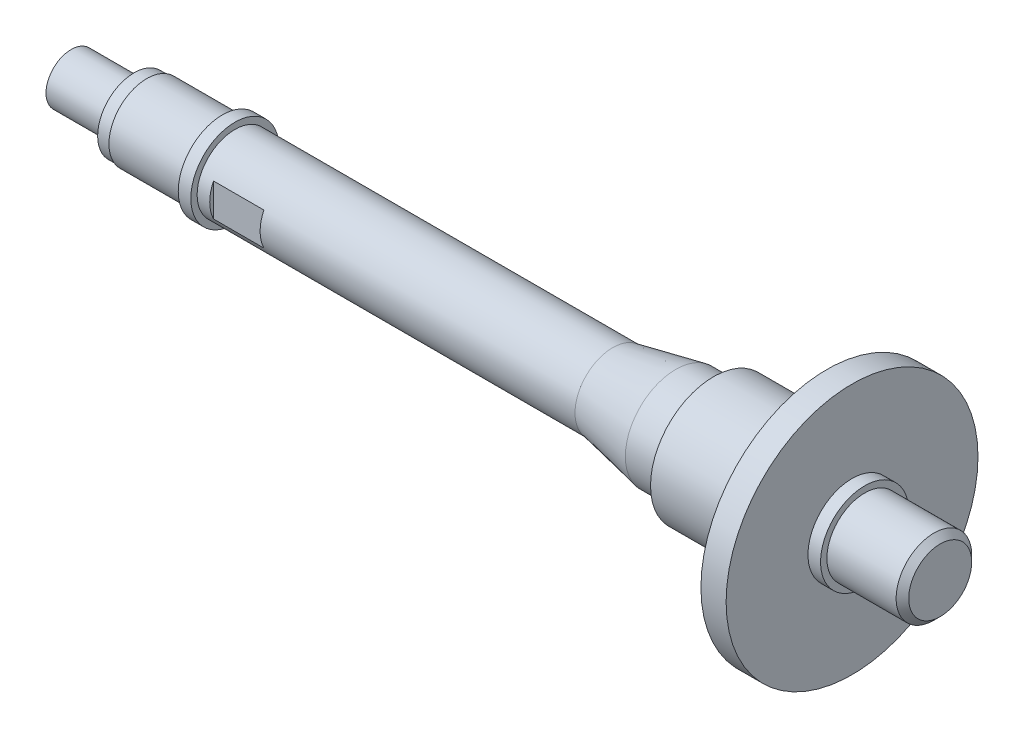
ISO-10303-21;
HEADER;
FILE_DESCRIPTION(('STEP AP214'),'2;1');
FILE_NAME('part.step','',(''),(''),'','','');
FILE_SCHEMA(('AUTOMOTIVE_DESIGN { 1 0 10303 214 1 1 1 1 }'));
ENDSEC;
DATA;
#1=APPLICATION_CONTEXT('core data for automotive mechanical design processes');
#2=APPLICATION_PROTOCOL_DEFINITION('international standard','automotive_design',2000,#1);
#3=PRODUCT_CONTEXT('',#1,'mechanical');
#4=PRODUCT('Part','Part','',(#3));
#5=PRODUCT_RELATED_PRODUCT_CATEGORY('part','',(#4));
#6=PRODUCT_DEFINITION_FORMATION('','',#4);
#7=PRODUCT_DEFINITION_CONTEXT('part definition',#1,'design');
#8=PRODUCT_DEFINITION('design','',#6,#7);
#9=PRODUCT_DEFINITION_SHAPE('','',#8);
#10=(LENGTH_UNIT() NAMED_UNIT(*) SI_UNIT(.MILLI.,.METRE.));
#11=(NAMED_UNIT(*) PLANE_ANGLE_UNIT() SI_UNIT($,.RADIAN.));
#12=(NAMED_UNIT(*) SI_UNIT($,.STERADIAN.) SOLID_ANGLE_UNIT());
#13=UNCERTAINTY_MEASURE_WITH_UNIT(LENGTH_MEASURE(1.E-05),#10,'distance_accuracy_value','');
#14=(GEOMETRIC_REPRESENTATION_CONTEXT(3) GLOBAL_UNCERTAINTY_ASSIGNED_CONTEXT((#13)) GLOBAL_UNIT_ASSIGNED_CONTEXT((#10,
#11,#12)) REPRESENTATION_CONTEXT('',''));
#15=CARTESIAN_POINT('',(0.,0.,0.));
#16=DIRECTION('',(0.,0.,1.));
#17=DIRECTION('',(1.,0.,0.));
#18=AXIS2_PLACEMENT_3D('',#15,#16,#17);
#19=CARTESIAN_POINT('',(-54.,0.,0.));
#20=DIRECTION('',(-1.,0.,0.));
#21=DIRECTION('',(0.,0.,1.));
#22=AXIS2_PLACEMENT_3D('',#19,#20,#21);
#23=CYLINDRICAL_SURFACE('',#22,2.9);
#24=CARTESIAN_POINT('',(-54.,0.,0.));
#25=DIRECTION('',(-1.,0.,0.));
#26=DIRECTION('',(0.,0.,1.));
#27=AXIS2_PLACEMENT_3D('',#24,#25,#26);
#28=CIRCLE('',#27,2.9);
#29=CARTESIAN_POINT('',(-54.,0.,2.9));
#30=VERTEX_POINT('',#29);
#31=EDGE_CURVE('E181',#30,#30,#28,.T.);
#32=ORIENTED_EDGE('',*,*,#31,.T.);
#33=EDGE_LOOP('',(#32));
#34=FACE_BOUND('',#33,.T.);
#35=CARTESIAN_POINT('',(-55.,0.,0.));
#36=DIRECTION('',(-1.,0.,0.));
#37=DIRECTION('',(0.,0.,1.));
#38=AXIS2_PLACEMENT_3D('',#35,#36,#37);
#39=CIRCLE('',#38,2.9);
#40=CARTESIAN_POINT('',(-55.,0.,2.9));
#41=VERTEX_POINT('',#40);
#42=EDGE_CURVE('E184',#41,#41,#39,.T.);
#43=ORIENTED_EDGE('',*,*,#42,.F.);
#44=EDGE_LOOP('',(#43));
#45=FACE_BOUND('',#44,.T.);
#46=ADVANCED_FACE('F42',(#34,#45),#23,.T.);
#47=CARTESIAN_POINT('',(-57.,0.,0.));
#48=DIRECTION('',(1.,0.,0.));
#49=DIRECTION('',(0.,0.,-1.));
#50=AXIS2_PLACEMENT_3D('',#47,#48,#49);
#51=CYLINDRICAL_SURFACE('',#50,3.);
#52=CARTESIAN_POINT('',(-48.,0.,0.));
#53=DIRECTION('',(-1.,0.,0.));
#54=DIRECTION('',(0.,0.,1.));
#55=AXIS2_PLACEMENT_3D('',#52,#53,#54);
#56=CIRCLE('',#55,3.);
#57=CARTESIAN_POINT('',(-48.,0.,3.));
#58=VERTEX_POINT('',#57);
#59=EDGE_CURVE('E147',#58,#58,#56,.T.);
#60=ORIENTED_EDGE('',*,*,#59,.T.);
#61=EDGE_LOOP('',(#60));
#62=FACE_BOUND('',#61,.T.);
#63=CARTESIAN_POINT('',(-54.,0.,0.));
#64=DIRECTION('',(-1.,0.,0.));
#65=DIRECTION('',(0.,0.,1.));
#66=AXIS2_PLACEMENT_3D('',#63,#64,#65);
#67=CIRCLE('',#66,3.);
#68=CARTESIAN_POINT('',(-54.,0.,3.));
#69=VERTEX_POINT('',#68);
#70=EDGE_CURVE('E178',#69,#69,#67,.T.);
#71=ORIENTED_EDGE('',*,*,#70,.F.);
#72=EDGE_LOOP('',(#71));
#73=FACE_BOUND('',#72,.T.);
#74=ADVANCED_FACE('F202',(#62,#73),#51,.T.);
#75=CARTESIAN_POINT('',(-3.,0.,0.));
#76=DIRECTION('',(-1.,0.,0.));
#77=DIRECTION('',(0.,0.,1.));
#78=AXIS2_PLACEMENT_3D('',#75,#76,#77);
#79=PLANE('',#78);
#80=CARTESIAN_POINT('',(-3.,0.,0.));
#81=DIRECTION('',(-1.,0.,0.));
#82=DIRECTION('',(0.,0.,1.));
#83=AXIS2_PLACEMENT_3D('',#80,#81,#82);
#84=CIRCLE('',#83,4.5);
#85=CARTESIAN_POINT('',(-3.,0.,4.5));
#86=VERTEX_POINT('',#85);
#87=EDGE_CURVE('E163',#86,#86,#84,.T.);
#88=ORIENTED_EDGE('',*,*,#87,.T.);
#89=EDGE_LOOP('',(#88));
#90=FACE_BOUND('',#89,.T.);
#91=CARTESIAN_POINT('',(-3.,0.,0.));
#92=DIRECTION('',(-1.,0.,0.));
#93=DIRECTION('',(0.,0.,1.));
#94=AXIS2_PLACEMENT_3D('',#91,#92,#93);
#95=CIRCLE('',#94,5.);
#96=CARTESIAN_POINT('',(-3.,0.,5.));
#97=VERTEX_POINT('',#96);
#98=EDGE_CURVE('E167',#97,#97,#95,.T.);
#99=ORIENTED_EDGE('',*,*,#98,.F.);
#100=EDGE_LOOP('',(#99));
#101=FACE_BOUND('',#100,.T.);
#102=ADVANCED_FACE('F208',(#90,#101),#79,.F.);
#103=CARTESIAN_POINT('',(-2.,0.,0.));
#104=DIRECTION('',(-1.,0.,0.));
#105=DIRECTION('',(0.,0.,1.));
#106=AXIS2_PLACEMENT_3D('',#103,#104,#105);
#107=PLANE('',#106);
#108=CARTESIAN_POINT('',(-2.,0.,0.));
#109=DIRECTION('',(-1.,0.,0.));
#110=DIRECTION('',(0.,0.,1.));
#111=AXIS2_PLACEMENT_3D('',#108,#109,#110);
#112=CIRCLE('',#111,6.);
#113=CARTESIAN_POINT('',(-2.,0.,6.));
#114=VERTEX_POINT('',#113);
#115=EDGE_CURVE('E95',#114,#114,#112,.T.);
#116=ORIENTED_EDGE('',*,*,#115,.T.);
#117=EDGE_LOOP('',(#116));
#118=FACE_BOUND('',#117,.T.);
#119=CARTESIAN_POINT('',(-2.,0.,0.));
#120=DIRECTION('',(-1.,0.,0.));
#121=DIRECTION('',(0.,0.,1.));
#122=AXIS2_PLACEMENT_3D('',#119,#120,#121);
#123=CIRCLE('',#122,4.5);
#124=CARTESIAN_POINT('',(-2.,0.,4.5));
#125=VERTEX_POINT('',#124);
#126=EDGE_CURVE('E164',#125,#125,#123,.T.);
#127=ORIENTED_EDGE('',*,*,#126,.F.);
#128=EDGE_LOOP('',(#127));
#129=FACE_BOUND('',#128,.T.);
#130=ADVANCED_FACE('F231',(#118,#129),#107,.T.);
#131=CARTESIAN_POINT('',(-3.,0.,0.));
#132=DIRECTION('',(1.,0.,0.));
#133=DIRECTION('',(0.,0.,-1.));
#134=AXIS2_PLACEMENT_3D('',#131,#132,#133);
#135=CYLINDRICAL_SURFACE('',#134,4.5);
#136=ORIENTED_EDGE('',*,*,#87,.F.);
#137=EDGE_LOOP('',(#136));
#138=FACE_BOUND('',#137,.T.);
#139=ORIENTED_EDGE('',*,*,#126,.T.);
#140=EDGE_LOOP('',(#139));
#141=FACE_BOUND('',#140,.T.);
#142=ADVANCED_FACE('F227',(#138,#141),#135,.T.);
#143=CARTESIAN_POINT('',(9.,0.,0.));
#144=DIRECTION('',(1.,0.,0.));
#145=DIRECTION('',(0.,0.,-1.));
#146=AXIS2_PLACEMENT_3D('',#143,#144,#145);
#147=PLANE('',#146);
#148=CARTESIAN_POINT('',(9.,0.,0.));
#149=DIRECTION('',(1.,0.,0.));
#150=DIRECTION('',(0.,0.,-1.));
#151=AXIS2_PLACEMENT_3D('',#148,#149,#150);
#152=CIRCLE('',#151,2.5);
#153=CARTESIAN_POINT('',(9.,0.,-2.5));
#154=VERTEX_POINT('',#153);
#155=EDGE_CURVE('E113',#154,#154,#152,.T.);
#156=ORIENTED_EDGE('',*,*,#155,.T.);
#157=EDGE_LOOP('',(#156));
#158=FACE_BOUND('',#157,.T.);
#159=ADVANCED_FACE('F230',(#158),#147,.T.);
#160=CARTESIAN_POINT('',(9.,0.,0.));
#161=DIRECTION('',(-1.,0.,0.));
#162=DIRECTION('',(0.,0.,1.));
#163=AXIS2_PLACEMENT_3D('',#160,#161,#162);
#164=CONICAL_SURFACE('',#163,2.5,0.785398163397451);
#165=CARTESIAN_POINT('',(8.50000000000001,0.,0.));
#166=DIRECTION('',(1.,0.,0.));
#167=DIRECTION('',(0.,0.,-1.));
#168=AXIS2_PLACEMENT_3D('',#165,#166,#167);
#169=CIRCLE('',#168,3.);
#170=CARTESIAN_POINT('',(8.50000000000001,0.,-3.));
#171=VERTEX_POINT('',#170);
#172=EDGE_CURVE('E110',#171,#171,#169,.F.);
#173=ORIENTED_EDGE('',*,*,#172,.F.);
#174=EDGE_LOOP('',(#173));
#175=FACE_BOUND('',#174,.T.);
#176=ORIENTED_EDGE('',*,*,#155,.F.);
#177=EDGE_LOOP('',(#176));
#178=FACE_BOUND('',#177,.T.);
#179=ADVANCED_FACE('F44',(#175,#178),#164,.T.);
#180=CARTESIAN_POINT('',(9.,0.,0.));
#181=DIRECTION('',(-1.,0.,0.));
#182=DIRECTION('',(0.,0.,1.));
#183=AXIS2_PLACEMENT_3D('',#180,#181,#182);
#184=CYLINDRICAL_SURFACE('',#183,3.);
#185=ORIENTED_EDGE('',*,*,#172,.T.);
#186=EDGE_LOOP('',(#185));
#187=FACE_BOUND('',#186,.T.);
#188=CARTESIAN_POINT('',(3.,0.,0.));
#189=DIRECTION('',(1.,0.,0.));
#190=DIRECTION('',(0.,0.,-1.));
#191=AXIS2_PLACEMENT_3D('',#188,#189,#190);
#192=CIRCLE('',#191,3.);
#193=CARTESIAN_POINT('',(3.,0.,-3.));
#194=VERTEX_POINT('',#193);
#195=EDGE_CURVE('E135',#194,#194,#192,.T.);
#196=ORIENTED_EDGE('',*,*,#195,.T.);
#197=EDGE_LOOP('',(#196));
#198=FACE_BOUND('',#197,.T.);
#199=ADVANCED_FACE('F281',(#187,#198),#184,.T.);
#200=CARTESIAN_POINT('',(3.,0.,0.));
#201=DIRECTION('',(1.,0.,0.));
#202=DIRECTION('',(0.,0.,-1.));
#203=AXIS2_PLACEMENT_3D('',#200,#201,#202);
#204=PLANE('',#203);
#205=CARTESIAN_POINT('',(3.,0.,0.));
#206=DIRECTION('',(1.,0.,0.));
#207=DIRECTION('',(0.,0.,-1.));
#208=AXIS2_PLACEMENT_3D('',#205,#206,#207);
#209=CIRCLE('',#208,3.5);
#210=CARTESIAN_POINT('',(3.,0.,-3.5));
#211=VERTEX_POINT('',#210);
#212=EDGE_CURVE('E123',#211,#211,#209,.T.);
#213=ORIENTED_EDGE('',*,*,#212,.T.);
#214=EDGE_LOOP('',(#213));
#215=FACE_BOUND('',#214,.T.);
#216=ORIENTED_EDGE('',*,*,#195,.F.);
#217=EDGE_LOOP('',(#216));
#218=FACE_BOUND('',#217,.T.);
#219=ADVANCED_FACE('F284',(#215,#218),#204,.T.);
#220=CARTESIAN_POINT('',(3.,0.,0.));
#221=DIRECTION('',(-1.,0.,0.));
#222=DIRECTION('',(0.,0.,1.));
#223=AXIS2_PLACEMENT_3D('',#220,#221,#222);
#224=CYLINDRICAL_SURFACE('',#223,3.5);
#225=ORIENTED_EDGE('',*,*,#212,.F.);
#226=EDGE_LOOP('',(#225));
#227=FACE_BOUND('',#226,.T.);
#228=CARTESIAN_POINT('',(2.,0.,0.));
#229=DIRECTION('',(1.,0.,0.));
#230=DIRECTION('',(0.,0.,-1.));
#231=AXIS2_PLACEMENT_3D('',#228,#229,#230);
#232=CIRCLE('',#231,3.5);
#233=CARTESIAN_POINT('',(2.,0.,-3.5));
#234=VERTEX_POINT('',#233);
#235=EDGE_CURVE('E126',#234,#234,#232,.T.);
#236=ORIENTED_EDGE('',*,*,#235,.T.);
#237=EDGE_LOOP('',(#236));
#238=FACE_BOUND('',#237,.T.);
#239=ADVANCED_FACE('F298',(#227,#238),#224,.T.);
#240=CARTESIAN_POINT('',(2.,0.,0.));
#241=DIRECTION('',(1.,0.,0.));
#242=DIRECTION('',(0.,0.,-1.));
#243=AXIS2_PLACEMENT_3D('',#240,#241,#242);
#244=PLANE('',#243);
#245=CARTESIAN_POINT('',(2.,0.,0.));
#246=DIRECTION('',(1.,0.,0.));
#247=DIRECTION('',(0.,0.,-1.));
#248=AXIS2_PLACEMENT_3D('',#245,#246,#247);
#249=CIRCLE('',#248,10.);
#250=CARTESIAN_POINT('',(2.,0.,-10.));
#251=VERTEX_POINT('',#250);
#252=EDGE_CURVE('E119',#251,#251,#249,.T.);
#253=ORIENTED_EDGE('',*,*,#252,.T.);
#254=EDGE_LOOP('',(#253));
#255=FACE_BOUND('',#254,.T.);
#256=ORIENTED_EDGE('',*,*,#235,.F.);
#257=EDGE_LOOP('',(#256));
#258=FACE_BOUND('',#257,.T.);
#259=ADVANCED_FACE('F302',(#255,#258),#244,.T.);
#260=CARTESIAN_POINT('',(2.,0.,0.));
#261=DIRECTION('',(-1.,0.,0.));
#262=DIRECTION('',(0.,0.,1.));
#263=AXIS2_PLACEMENT_3D('',#260,#261,#262);
#264=CYLINDRICAL_SURFACE('',#263,10.);
#265=ORIENTED_EDGE('',*,*,#252,.F.);
#266=EDGE_LOOP('',(#265));
#267=FACE_BOUND('',#266,.T.);
#268=CARTESIAN_POINT('',(0.,0.,0.));
#269=DIRECTION('',(1.,0.,0.));
#270=DIRECTION('',(0.,0.,-1.));
#271=AXIS2_PLACEMENT_3D('',#268,#269,#270);
#272=CIRCLE('',#271,10.);
#273=CARTESIAN_POINT('',(0.,0.,-10.));
#274=VERTEX_POINT('',#273);
#275=EDGE_CURVE('E120',#274,#274,#272,.T.);
#276=ORIENTED_EDGE('',*,*,#275,.T.);
#277=EDGE_LOOP('',(#276));
#278=FACE_BOUND('',#277,.T.);
#279=ADVANCED_FACE('F306',(#267,#278),#264,.T.);
#280=CARTESIAN_POINT('',(0.,0.,0.));
#281=DIRECTION('',(1.,0.,0.));
#282=DIRECTION('',(0.,0.,-1.));
#283=AXIS2_PLACEMENT_3D('',#280,#281,#282);
#284=PLANE('',#283);
#285=ORIENTED_EDGE('',*,*,#275,.F.);
#286=EDGE_LOOP('',(#285));
#287=FACE_BOUND('',#286,.T.);
#288=CARTESIAN_POINT('',(0.,0.,0.));
#289=DIRECTION('',(1.,0.,0.));
#290=DIRECTION('',(0.,0.,-1.));
#291=AXIS2_PLACEMENT_3D('',#288,#289,#290);
#292=CIRCLE('',#291,6.);
#293=CARTESIAN_POINT('',(0.,0.,-6.));
#294=VERTEX_POINT('',#293);
#295=EDGE_CURVE('E116',#294,#294,#292,.F.);
#296=ORIENTED_EDGE('',*,*,#295,.F.);
#297=EDGE_LOOP('',(#296));
#298=FACE_BOUND('',#297,.T.);
#299=ADVANCED_FACE('F294',(#287,#298),#284,.F.);
#300=CARTESIAN_POINT('',(-9.,0.,0.));
#301=DIRECTION('',(1.,0.,0.));
#302=DIRECTION('',(0.,0.,-1.));
#303=AXIS2_PLACEMENT_3D('',#300,#301,#302);
#304=CYLINDRICAL_SURFACE('',#303,6.);
#305=ORIENTED_EDGE('',*,*,#295,.T.);
#306=EDGE_LOOP('',(#305));
#307=FACE_BOUND('',#306,.T.);
#308=ORIENTED_EDGE('',*,*,#115,.F.);
#309=EDGE_LOOP('',(#308));
#310=FACE_BOUND('',#309,.T.);
#311=ADVANCED_FACE('F225',(#307,#310),#304,.T.);
#312=CARTESIAN_POINT('',(-3.,0.,0.));
#313=DIRECTION('',(-1.,0.,0.));
#314=DIRECTION('',(0.,0.,1.));
#315=AXIS2_PLACEMENT_3D('',#312,#313,#314);
#316=CYLINDRICAL_SURFACE('',#315,5.);
#317=ORIENTED_EDGE('',*,*,#98,.T.);
#318=EDGE_LOOP('',(#317));
#319=FACE_BOUND('',#318,.T.);
#320=CARTESIAN_POINT('',(-9.,0.,0.));
#321=DIRECTION('',(-1.,0.,0.));
#322=DIRECTION('',(0.,0.,1.));
#323=AXIS2_PLACEMENT_3D('',#320,#321,#322);
#324=CIRCLE('',#323,5.);
#325=CARTESIAN_POINT('',(-9.,0.,5.));
#326=VERTEX_POINT('',#325);
#327=EDGE_CURVE('E170',#326,#326,#324,.T.);
#328=ORIENTED_EDGE('',*,*,#327,.F.);
#329=EDGE_LOOP('',(#328));
#330=FACE_BOUND('',#329,.T.);
#331=ADVANCED_FACE('F221',(#319,#330),#316,.T.);
#332=CARTESIAN_POINT('',(-12.,0.,0.));
#333=DIRECTION('',(1.,0.,0.));
#334=DIRECTION('',(0.,0.,-1.));
#335=AXIS2_PLACEMENT_3D('',#332,#333,#334);
#336=CYLINDRICAL_SURFACE('',#335,4.);
#337=CARTESIAN_POINT('',(-12.,0.,0.));
#338=DIRECTION('',(-1.,0.,0.));
#339=DIRECTION('',(0.,0.,1.));
#340=AXIS2_PLACEMENT_3D('',#337,#338,#339);
#341=CIRCLE('',#340,4.);
#342=CARTESIAN_POINT('',(-12.,0.,4.));
#343=VERTEX_POINT('',#342);
#344=EDGE_CURVE('E129',#343,#343,#341,.T.);
#345=ORIENTED_EDGE('',*,*,#344,.F.);
#346=EDGE_LOOP('',(#345));
#347=FACE_BOUND('',#346,.T.);
#348=CARTESIAN_POINT('',(-9.,0.,0.));
#349=DIRECTION('',(-1.,0.,0.));
#350=DIRECTION('',(0.,0.,1.));
#351=AXIS2_PLACEMENT_3D('',#348,#349,#350);
#352=CIRCLE('',#351,4.);
#353=CARTESIAN_POINT('',(-9.,0.,4.));
#354=VERTEX_POINT('',#353);
#355=EDGE_CURVE('E132',#354,#354,#352,.T.);
#356=ORIENTED_EDGE('',*,*,#355,.T.);
#357=EDGE_LOOP('',(#356));
#358=FACE_BOUND('',#357,.T.);
#359=ADVANCED_FACE('F224',(#347,#358),#336,.T.);
#360=CARTESIAN_POINT('',(-9.,0.,0.));
#361=DIRECTION('',(-1.,0.,0.));
#362=DIRECTION('',(0.,0.,1.));
#363=AXIS2_PLACEMENT_3D('',#360,#361,#362);
#364=PLANE('',#363);
#365=ORIENTED_EDGE('',*,*,#355,.F.);
#366=EDGE_LOOP('',(#365));
#367=FACE_BOUND('',#366,.T.);
#368=ORIENTED_EDGE('',*,*,#327,.T.);
#369=EDGE_LOOP('',(#368));
#370=FACE_BOUND('',#369,.T.);
#371=ADVANCED_FACE('F219',(#367,#370),#364,.T.);
#372=CARTESIAN_POINT('',(-12.,0.,0.));
#373=DIRECTION('',(1.,0.,0.));
#374=DIRECTION('',(0.,0.,-1.));
#375=AXIS2_PLACEMENT_3D('',#372,#373,#374);
#376=CONICAL_SURFACE('',#375,4.,0.197395559849881);
#377=CARTESIAN_POINT('',(-17.,0.,0.));
#378=DIRECTION('',(1.,0.,0.));
#379=DIRECTION('',(0.,0.,-1.));
#380=AXIS2_PLACEMENT_3D('',#377,#378,#379);
#381=CIRCLE('',#380,3.);
#382=CARTESIAN_POINT('',(-17.,0.,-3.));
#383=VERTEX_POINT('',#382);
#384=EDGE_CURVE('E173',#383,#383,#381,.T.);
#385=ORIENTED_EDGE('',*,*,#384,.T.);
#386=EDGE_LOOP('',(#385));
#387=FACE_BOUND('',#386,.T.);
#388=ORIENTED_EDGE('',*,*,#344,.T.);
#389=EDGE_LOOP('',(#388));
#390=FACE_BOUND('',#389,.T.);
#391=ADVANCED_FACE('F215',(#387,#390),#376,.T.);
#392=CARTESIAN_POINT('',(-48.,0.,0.));
#393=DIRECTION('',(-1.,0.,0.));
#394=DIRECTION('',(0.,0.,1.));
#395=AXIS2_PLACEMENT_3D('',#392,#393,#394);
#396=PLANE('',#395);
#397=CARTESIAN_POINT('',(-48.,0.,0.));
#398=DIRECTION('',(-1.,0.,0.));
#399=DIRECTION('',(0.,0.,1.));
#400=AXIS2_PLACEMENT_3D('',#397,#398,#399);
#401=CIRCLE('',#400,3.5);
#402=CARTESIAN_POINT('',(-48.,0.,3.5));
#403=VERTEX_POINT('',#402);
#404=EDGE_CURVE('E143',#403,#403,#401,.T.);
#405=ORIENTED_EDGE('',*,*,#404,.T.);
#406=EDGE_LOOP('',(#405));
#407=FACE_BOUND('',#406,.T.);
#408=ORIENTED_EDGE('',*,*,#59,.F.);
#409=EDGE_LOOP('',(#408));
#410=FACE_BOUND('',#409,.T.);
#411=ADVANCED_FACE('F218',(#407,#410),#396,.T.);
#412=CARTESIAN_POINT('',(-48.,0.,0.));
#413=DIRECTION('',(1.,0.,0.));
#414=DIRECTION('',(0.,0.,-1.));
#415=AXIS2_PLACEMENT_3D('',#412,#413,#414);
#416=CYLINDRICAL_SURFACE('',#415,3.5);
#417=ORIENTED_EDGE('',*,*,#404,.F.);
#418=EDGE_LOOP('',(#417));
#419=FACE_BOUND('',#418,.T.);
#420=CARTESIAN_POINT('',(-47.,0.,0.));
#421=DIRECTION('',(-1.,0.,0.));
#422=DIRECTION('',(0.,0.,1.));
#423=AXIS2_PLACEMENT_3D('',#420,#421,#422);
#424=CIRCLE('',#423,3.5);
#425=CARTESIAN_POINT('',(-47.,0.,3.5));
#426=VERTEX_POINT('',#425);
#427=EDGE_CURVE('E144',#426,#426,#424,.T.);
#428=ORIENTED_EDGE('',*,*,#427,.T.);
#429=EDGE_LOOP('',(#428));
#430=FACE_BOUND('',#429,.T.);
#431=ADVANCED_FACE('F267',(#419,#430),#416,.T.);
#432=CARTESIAN_POINT('',(-47.,0.,0.));
#433=DIRECTION('',(-1.,0.,0.));
#434=DIRECTION('',(0.,0.,1.));
#435=AXIS2_PLACEMENT_3D('',#432,#433,#434);
#436=PLANE('',#435);
#437=ORIENTED_EDGE('',*,*,#427,.F.);
#438=EDGE_LOOP('',(#437));
#439=FACE_BOUND('',#438,.T.);
#440=CARTESIAN_POINT('',(-47.,0.,0.));
#441=DIRECTION('',(-1.,0.,0.));
#442=DIRECTION('',(0.,0.,1.));
#443=AXIS2_PLACEMENT_3D('',#440,#441,#442);
#444=CIRCLE('',#443,3.);
#445=CARTESIAN_POINT('',(-47.,0.,3.));
#446=VERTEX_POINT('',#445);
#447=EDGE_CURVE('E140',#446,#446,#444,.T.);
#448=ORIENTED_EDGE('',*,*,#447,.T.);
#449=EDGE_LOOP('',(#448));
#450=FACE_BOUND('',#449,.T.);
#451=ADVANCED_FACE('F258',(#439,#450),#436,.F.);
#452=CARTESIAN_POINT('',(-46.,-5.,-3.));
#453=DIRECTION('',(-1.,0.,0.));
#454=DIRECTION('',(0.,0.,1.));
#455=AXIS2_PLACEMENT_3D('',#452,#453,#454);
#456=PLANE('',#455);
#457=DIRECTION('',(0.,1.,0.));
#458=VECTOR('',#457,1.);
#459=CARTESIAN_POINT('',(-46.,-5.,-2.7));
#460=LINE('',#459,#458);
#461=CARTESIAN_POINT('',(-46.,-1.3076696830622,-2.7));
#462=VERTEX_POINT('',#461);
#463=CARTESIAN_POINT('',(-46.,1.3076696830622,-2.7));
#464=VERTEX_POINT('',#463);
#465=EDGE_CURVE('E156',#462,#464,#460,.T.);
#466=ORIENTED_EDGE('',*,*,#465,.F.);
#467=CARTESIAN_POINT('',(-46.,0.,0.));
#468=DIRECTION('',(-1.,0.,0.));
#469=DIRECTION('',(0.,0.,1.));
#470=AXIS2_PLACEMENT_3D('',#467,#468,#469);
#471=CIRCLE('',#470,3.);
#472=EDGE_CURVE('E63',#464,#462,#471,.T.);
#473=ORIENTED_EDGE('',*,*,#472,.F.);
#474=EDGE_LOOP('',(#466,#473));
#475=FACE_BOUND('',#474,.T.);
#476=ADVANCED_FACE('F251',(#475),#456,.F.);
#477=CARTESIAN_POINT('',(-42.,-5.,-3.));
#478=DIRECTION('',(1.,0.,0.));
#479=DIRECTION('',(0.,0.,-1.));
#480=AXIS2_PLACEMENT_3D('',#477,#478,#479);
#481=PLANE('',#480);
#482=CARTESIAN_POINT('',(-42.,0.,0.));
#483=DIRECTION('',(1.,0.,0.));
#484=DIRECTION('',(0.,0.,-1.));
#485=AXIS2_PLACEMENT_3D('',#482,#483,#484);
#486=CIRCLE('',#485,3.);
#487=CARTESIAN_POINT('',(-42.,-1.3076696830622,-2.7));
#488=VERTEX_POINT('',#487);
#489=CARTESIAN_POINT('',(-42.,1.3076696830622,-2.7));
#490=VERTEX_POINT('',#489);
#491=EDGE_CURVE('E104',#488,#490,#486,.T.);
#492=ORIENTED_EDGE('',*,*,#491,.F.);
#493=DIRECTION('',(0.,1.,0.));
#494=VECTOR('',#493,1.);
#495=CARTESIAN_POINT('',(-42.,-5.,-2.7));
#496=LINE('',#495,#494);
#497=EDGE_CURVE('E155',#488,#490,#496,.T.);
#498=ORIENTED_EDGE('',*,*,#497,.T.);
#499=EDGE_LOOP('',(#492,#498));
#500=FACE_BOUND('',#499,.T.);
#501=ADVANCED_FACE('F248',(#500),#481,.F.);
#502=CARTESIAN_POINT('',(-46.,-5.,-2.7));
#503=DIRECTION('',(0.,0.,1.));
#504=DIRECTION('',(1.,0.,0.));
#505=AXIS2_PLACEMENT_3D('',#502,#503,#504);
#506=PLANE('',#505);
#507=ORIENTED_EDGE('',*,*,#465,.T.);
#508=DIRECTION('',(1.,0.,0.));
#509=VECTOR('',#508,1.);
#510=CARTESIAN_POINT('',(-47.,1.3076696830622,-2.7));
#511=LINE('',#510,#509);
#512=EDGE_CURVE('E107',#490,#464,#511,.F.);
#513=ORIENTED_EDGE('',*,*,#512,.F.);
#514=ORIENTED_EDGE('',*,*,#497,.F.);
#515=DIRECTION('',(1.,0.,0.));
#516=VECTOR('',#515,1.);
#517=CARTESIAN_POINT('',(-47.,-1.3076696830622,-2.7));
#518=LINE('',#517,#516);
#519=EDGE_CURVE('E87',#462,#488,#518,.T.);
#520=ORIENTED_EDGE('',*,*,#519,.F.);
#521=EDGE_LOOP('',(#507,#513,#514,#520));
#522=FACE_BOUND('',#521,.T.);
#523=ADVANCED_FACE('F247',(#522),#506,.F.);
#524=CARTESIAN_POINT('',(-42.,-5.,3.));
#525=DIRECTION('',(1.,0.,0.));
#526=DIRECTION('',(0.,0.,-1.));
#527=AXIS2_PLACEMENT_3D('',#524,#525,#526);
#528=PLANE('',#527);
#529=DIRECTION('',(0.,1.,0.));
#530=VECTOR('',#529,1.);
#531=CARTESIAN_POINT('',(-42.,-5.,2.7));
#532=LINE('',#531,#530);
#533=CARTESIAN_POINT('',(-42.,-1.3076696830622,2.7));
#534=VERTEX_POINT('',#533);
#535=CARTESIAN_POINT('',(-42.,1.3076696830622,2.7));
#536=VERTEX_POINT('',#535);
#537=EDGE_CURVE('E56',#534,#536,#532,.T.);
#538=ORIENTED_EDGE('',*,*,#537,.F.);
#539=CARTESIAN_POINT('',(-42.,0.,0.));
#540=DIRECTION('',(1.,0.,0.));
#541=DIRECTION('',(0.,0.,-1.));
#542=AXIS2_PLACEMENT_3D('',#539,#540,#541);
#543=CIRCLE('',#542,3.);
#544=EDGE_CURVE('E81',#536,#534,#543,.T.);
#545=ORIENTED_EDGE('',*,*,#544,.F.);
#546=EDGE_LOOP('',(#538,#545));
#547=FACE_BOUND('',#546,.T.);
#548=ADVANCED_FACE('F82',(#547),#528,.F.);
#549=CARTESIAN_POINT('',(-46.,-5.,2.7));
#550=DIRECTION('',(0.,0.,-1.));
#551=DIRECTION('',(-1.,0.,0.));
#552=AXIS2_PLACEMENT_3D('',#549,#550,#551);
#553=PLANE('',#552);
#554=DIRECTION('',(0.,1.,0.));
#555=VECTOR('',#554,1.);
#556=CARTESIAN_POINT('',(-46.,-5.,2.7));
#557=LINE('',#556,#555);
#558=CARTESIAN_POINT('',(-46.,-1.3076696830622,2.7));
#559=VERTEX_POINT('',#558);
#560=CARTESIAN_POINT('',(-46.,1.3076696830622,2.7));
#561=VERTEX_POINT('',#560);
#562=EDGE_CURVE('E94',#559,#561,#557,.T.);
#563=ORIENTED_EDGE('',*,*,#562,.F.);
#564=DIRECTION('',(1.,0.,0.));
#565=VECTOR('',#564,1.);
#566=CARTESIAN_POINT('',(-47.,-1.3076696830622,2.7));
#567=LINE('',#566,#565);
#568=EDGE_CURVE('E86',#534,#559,#567,.F.);
#569=ORIENTED_EDGE('',*,*,#568,.F.);
#570=ORIENTED_EDGE('',*,*,#537,.T.);
#571=DIRECTION('',(1.,0.,0.));
#572=VECTOR('',#571,1.);
#573=CARTESIAN_POINT('',(-47.,1.3076696830622,2.7));
#574=LINE('',#573,#572);
#575=EDGE_CURVE('E50',#561,#536,#574,.T.);
#576=ORIENTED_EDGE('',*,*,#575,.F.);
#577=EDGE_LOOP('',(#563,#569,#570,#576));
#578=FACE_BOUND('',#577,.T.);
#579=ADVANCED_FACE('F92',(#578),#553,.F.);
#580=CARTESIAN_POINT('',(-46.,-5.,3.));
#581=DIRECTION('',(-1.,0.,0.));
#582=DIRECTION('',(0.,0.,1.));
#583=AXIS2_PLACEMENT_3D('',#580,#581,#582);
#584=PLANE('',#583);
#585=CARTESIAN_POINT('',(-46.,0.,0.));
#586=DIRECTION('',(-1.,0.,0.));
#587=DIRECTION('',(0.,0.,1.));
#588=AXIS2_PLACEMENT_3D('',#585,#586,#587);
#589=CIRCLE('',#588,3.);
#590=EDGE_CURVE('E11',#559,#561,#589,.T.);
#591=ORIENTED_EDGE('',*,*,#590,.F.);
#592=ORIENTED_EDGE('',*,*,#562,.T.);
#593=EDGE_LOOP('',(#591,#592));
#594=FACE_BOUND('',#593,.T.);
#595=ADVANCED_FACE('F239',(#594),#584,.F.);
#596=CARTESIAN_POINT('',(-47.,0.,0.));
#597=DIRECTION('',(1.,0.,0.));
#598=DIRECTION('',(0.,0.,-1.));
#599=AXIS2_PLACEMENT_3D('',#596,#597,#598);
#600=CYLINDRICAL_SURFACE('',#599,3.);
#601=ORIENTED_EDGE('',*,*,#384,.F.);
#602=EDGE_LOOP('',(#601));
#603=FACE_BOUND('',#602,.T.);
#604=ORIENTED_EDGE('',*,*,#590,.T.);
#605=ORIENTED_EDGE('',*,*,#575,.T.);
#606=ORIENTED_EDGE('',*,*,#544,.T.);
#607=ORIENTED_EDGE('',*,*,#568,.T.);
#608=EDGE_LOOP('',(#604,#605,#606,#607));
#609=FACE_BOUND('',#608,.T.);
#610=ORIENTED_EDGE('',*,*,#519,.T.);
#611=ORIENTED_EDGE('',*,*,#491,.T.);
#612=ORIENTED_EDGE('',*,*,#512,.T.);
#613=ORIENTED_EDGE('',*,*,#472,.T.);
#614=EDGE_LOOP('',(#610,#611,#612,#613));
#615=FACE_BOUND('',#614,.T.);
#616=ORIENTED_EDGE('',*,*,#447,.F.);
#617=EDGE_LOOP('',(#616));
#618=FACE_BOUND('',#617,.T.);
#619=ADVANCED_FACE('F97',(#603,#609,#615,#618),#600,.T.);
#620=CARTESIAN_POINT('',(-54.,0.,0.));
#621=DIRECTION('',(-1.,0.,0.));
#622=DIRECTION('',(0.,0.,1.));
#623=AXIS2_PLACEMENT_3D('',#620,#621,#622);
#624=PLANE('',#623);
#625=ORIENTED_EDGE('',*,*,#31,.F.);
#626=EDGE_LOOP('',(#625));
#627=FACE_BOUND('',#626,.T.);
#628=ORIENTED_EDGE('',*,*,#70,.T.);
#629=EDGE_LOOP('',(#628));
#630=FACE_BOUND('',#629,.T.);
#631=ADVANCED_FACE('F197',(#627,#630),#624,.T.);
#632=CARTESIAN_POINT('',(-55.,0.,0.));
#633=DIRECTION('',(-1.,0.,0.));
#634=DIRECTION('',(0.,0.,1.));
#635=AXIS2_PLACEMENT_3D('',#632,#633,#634);
#636=PLANE('',#635);
#637=CARTESIAN_POINT('',(-55.,0.,0.));
#638=DIRECTION('',(-1.,0.,0.));
#639=DIRECTION('',(0.,0.,1.));
#640=AXIS2_PLACEMENT_3D('',#637,#638,#639);
#641=CIRCLE('',#640,2.);
#642=CARTESIAN_POINT('',(-55.,0.,2.));
#643=VERTEX_POINT('',#642);
#644=EDGE_CURVE('E187',#643,#643,#641,.T.);
#645=ORIENTED_EDGE('',*,*,#644,.F.);
#646=EDGE_LOOP('',(#645));
#647=FACE_BOUND('',#646,.T.);
#648=ORIENTED_EDGE('',*,*,#42,.T.);
#649=EDGE_LOOP('',(#648));
#650=FACE_BOUND('',#649,.T.);
#651=ADVANCED_FACE('F193',(#647,#650),#636,.T.);
#652=CARTESIAN_POINT('',(-60.,0.,0.));
#653=DIRECTION('',(-1.,0.,0.));
#654=DIRECTION('',(0.,0.,1.));
#655=AXIS2_PLACEMENT_3D('',#652,#653,#654);
#656=PLANE('',#655);
#657=CARTESIAN_POINT('',(-60.,0.,0.));
#658=DIRECTION('',(-1.,0.,0.));
#659=DIRECTION('',(0.,0.,1.));
#660=AXIS2_PLACEMENT_3D('',#657,#658,#659);
#661=CIRCLE('',#660,2.);
#662=CARTESIAN_POINT('',(-60.,0.,2.));
#663=VERTEX_POINT('',#662);
#664=EDGE_CURVE('E152',#663,#663,#661,.T.);
#665=ORIENTED_EDGE('',*,*,#664,.T.);
#666=EDGE_LOOP('',(#665));
#667=FACE_BOUND('',#666,.T.);
#668=ADVANCED_FACE('F196',(#667),#656,.T.);
#669=CARTESIAN_POINT('',(-60.,0.,0.));
#670=DIRECTION('',(1.,0.,0.));
#671=DIRECTION('',(0.,0.,-1.));
#672=AXIS2_PLACEMENT_3D('',#669,#670,#671);
#673=CYLINDRICAL_SURFACE('',#672,2.);
#674=ORIENTED_EDGE('',*,*,#664,.F.);
#675=EDGE_LOOP('',(#674));
#676=FACE_BOUND('',#675,.T.);
#677=ORIENTED_EDGE('',*,*,#644,.T.);
#678=EDGE_LOOP('',(#677));
#679=FACE_BOUND('',#678,.T.);
#680=ADVANCED_FACE('F191',(#676,#679),#673,.T.);
#681=CLOSED_SHELL('',(#46,#74,#102,#130,#142,#159,#179,#199,#219,#239,#259,#279,#299,#311,#331,
#359,#371,#391,#411,#431,#451,#476,#501,#523,#548,#579,#595,#619,#631,#651,#668,#680));
#682=MANIFOLD_SOLID_BREP('B2',#681);
#683=ADVANCED_BREP_SHAPE_REPRESENTATION('',(#18,#682),#14);
#684=SHAPE_DEFINITION_REPRESENTATION(#9,#683);
ENDSEC;
END-ISO-10303-21;
